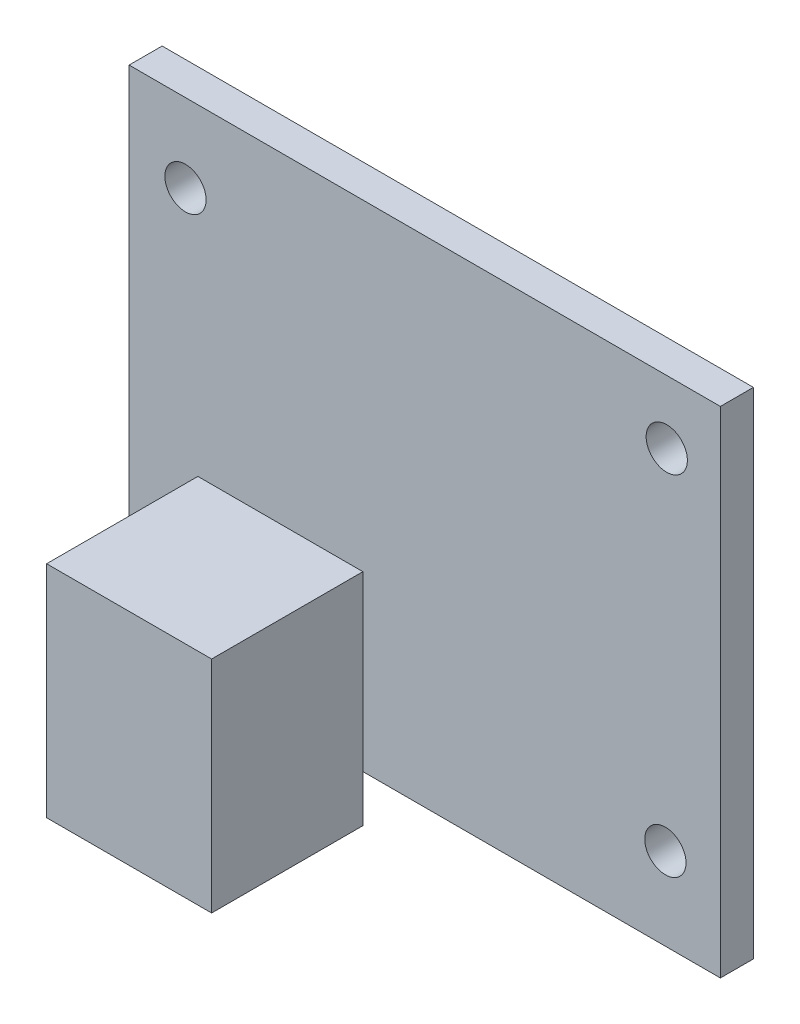
ISO-10303-21;
HEADER;
FILE_DESCRIPTION(('STEP AP214'),'2;1');
FILE_NAME('part.step','',(''),(''),'','','');
FILE_SCHEMA(('AUTOMOTIVE_DESIGN { 1 0 10303 214 1 1 1 1 }'));
ENDSEC;
DATA;
#1=APPLICATION_CONTEXT('core data for automotive mechanical design processes');
#2=APPLICATION_PROTOCOL_DEFINITION('international standard','automotive_design',2000,#1);
#3=PRODUCT_CONTEXT('',#1,'mechanical');
#4=PRODUCT('Part','Part','',(#3));
#5=PRODUCT_RELATED_PRODUCT_CATEGORY('part','',(#4));
#6=PRODUCT_DEFINITION_FORMATION('','',#4);
#7=PRODUCT_DEFINITION_CONTEXT('part definition',#1,'design');
#8=PRODUCT_DEFINITION('design','',#6,#7);
#9=PRODUCT_DEFINITION_SHAPE('','',#8);
#10=(LENGTH_UNIT() NAMED_UNIT(*) SI_UNIT(.MILLI.,.METRE.));
#11=(NAMED_UNIT(*) PLANE_ANGLE_UNIT() SI_UNIT($,.RADIAN.));
#12=(NAMED_UNIT(*) SI_UNIT($,.STERADIAN.) SOLID_ANGLE_UNIT());
#13=UNCERTAINTY_MEASURE_WITH_UNIT(LENGTH_MEASURE(1.E-05),#10,'distance_accuracy_value','');
#14=(GEOMETRIC_REPRESENTATION_CONTEXT(3) GLOBAL_UNCERTAINTY_ASSIGNED_CONTEXT((#13)) GLOBAL_UNIT_ASSIGNED_CONTEXT((#10,
#11,#12)) REPRESENTATION_CONTEXT('',''));
#15=CARTESIAN_POINT('',(0.,0.,0.));
#16=DIRECTION('',(0.,0.,1.));
#17=DIRECTION('',(1.,0.,0.));
#18=AXIS2_PLACEMENT_3D('',#15,#16,#17);
#19=CARTESIAN_POINT('',(0.,0.,2.4));
#20=DIRECTION('',(0.,0.,-1.));
#21=DIRECTION('',(-1.,0.,0.));
#22=AXIS2_PLACEMENT_3D('',#19,#20,#21);
#23=PLANE('',#22);
#24=CARTESIAN_POINT('',(39.1,31.4,2.4));
#25=DIRECTION('',(0.,0.,1.));
#26=DIRECTION('',(1.,0.,0.));
#27=AXIS2_PLACEMENT_3D('',#24,#25,#26);
#28=CIRCLE('',#27,1.5);
#29=CARTESIAN_POINT('',(40.6,31.4,2.4));
#30=VERTEX_POINT('',#29);
#31=EDGE_CURVE('E146',#30,#30,#28,.T.);
#32=ORIENTED_EDGE('',*,*,#31,.F.);
#33=EDGE_LOOP('',(#32));
#34=FACE_BOUND('',#33,.T.);
#35=CARTESIAN_POINT('',(4.09999999999999,30.3,2.4));
#36=DIRECTION('',(0.,0.,1.));
#37=DIRECTION('',(1.,0.,0.));
#38=AXIS2_PLACEMENT_3D('',#35,#36,#37);
#39=CIRCLE('',#38,1.5);
#40=CARTESIAN_POINT('',(5.59999999999999,30.3,2.4));
#41=VERTEX_POINT('',#40);
#42=EDGE_CURVE('E156',#41,#41,#39,.T.);
#43=ORIENTED_EDGE('',*,*,#42,.F.);
#44=EDGE_LOOP('',(#43));
#45=FACE_BOUND('',#44,.T.);
#46=CARTESIAN_POINT('',(39.,6.,2.4));
#47=DIRECTION('',(0.,0.,1.));
#48=DIRECTION('',(1.,0.,0.));
#49=AXIS2_PLACEMENT_3D('',#46,#47,#48);
#50=CIRCLE('',#49,1.5);
#51=CARTESIAN_POINT('',(40.5,6.,2.4));
#52=VERTEX_POINT('',#51);
#53=EDGE_CURVE('E164',#52,#52,#50,.T.);
#54=ORIENTED_EDGE('',*,*,#53,.F.);
#55=EDGE_LOOP('',(#54));
#56=FACE_BOUND('',#55,.T.);
#57=DIRECTION('',(0.,-1.,0.));
#58=VECTOR('',#57,1.);
#59=CARTESIAN_POINT('',(5.,12.5918610425844,2.4));
#60=LINE('',#59,#58);
#61=CARTESIAN_POINT('',(5.,12.5918610425844,2.4));
#62=VERTEX_POINT('',#61);
#63=CARTESIAN_POINT('',(5.,0.,2.4));
#64=VERTEX_POINT('',#63);
#65=EDGE_CURVE('E59',#62,#64,#60,.T.);
#66=ORIENTED_EDGE('',*,*,#65,.F.);
#67=DIRECTION('',(-1.,0.,0.));
#68=VECTOR('',#67,1.);
#69=CARTESIAN_POINT('',(5.,12.5918610425844,2.4));
#70=LINE('',#69,#68);
#71=CARTESIAN_POINT('',(17.,12.5918610425844,2.4));
#72=VERTEX_POINT('',#71);
#73=EDGE_CURVE('E134',#72,#62,#70,.T.);
#74=ORIENTED_EDGE('',*,*,#73,.F.);
#75=DIRECTION('',(0.,1.,0.));
#76=VECTOR('',#75,1.);
#77=CARTESIAN_POINT('',(17.,12.5918610425844,2.4));
#78=LINE('',#77,#76);
#79=CARTESIAN_POINT('',(17.,0.,2.4));
#80=VERTEX_POINT('',#79);
#81=EDGE_CURVE('E11',#80,#72,#78,.T.);
#82=ORIENTED_EDGE('',*,*,#81,.F.);
#83=DIRECTION('',(1.,0.,0.));
#84=VECTOR('',#83,1.);
#85=CARTESIAN_POINT('',(0.,0.,2.4));
#86=LINE('',#85,#84);
#87=CARTESIAN_POINT('',(43.,0.,2.4));
#88=VERTEX_POINT('',#87);
#89=EDGE_CURVE('E176',#80,#88,#86,.T.);
#90=ORIENTED_EDGE('',*,*,#89,.T.);
#91=DIRECTION('',(0.,1.,0.));
#92=VECTOR('',#91,1.);
#93=CARTESIAN_POINT('',(43.,0.,2.4));
#94=LINE('',#93,#92);
#95=CARTESIAN_POINT('',(43.,36.,2.4));
#96=VERTEX_POINT('',#95);
#97=EDGE_CURVE('E181',#88,#96,#94,.T.);
#98=ORIENTED_EDGE('',*,*,#97,.T.);
#99=DIRECTION('',(-1.,0.,0.));
#100=VECTOR('',#99,1.);
#101=CARTESIAN_POINT('',(0.,36.,2.4));
#102=LINE('',#101,#100);
#103=CARTESIAN_POINT('',(0.,36.,2.4));
#104=VERTEX_POINT('',#103);
#105=EDGE_CURVE('E185',#96,#104,#102,.T.);
#106=ORIENTED_EDGE('',*,*,#105,.T.);
#107=DIRECTION('',(0.,-1.,0.));
#108=VECTOR('',#107,1.);
#109=CARTESIAN_POINT('',(0.,0.,2.4));
#110=LINE('',#109,#108);
#111=CARTESIAN_POINT('',(0.,0.,2.4));
#112=VERTEX_POINT('',#111);
#113=EDGE_CURVE('E172',#104,#112,#110,.T.);
#114=ORIENTED_EDGE('',*,*,#113,.T.);
#115=EDGE_CURVE('E178',#112,#64,#86,.T.);
#116=ORIENTED_EDGE('',*,*,#115,.T.);
#117=EDGE_LOOP('',(#66,#74,#82,#90,#98,#106,#114,#116));
#118=FACE_BOUND('',#117,.T.);
#119=ADVANCED_FACE('F41',(#34,#45,#56,#118),#23,.F.);
#120=CARTESIAN_POINT('',(0.,0.,0.));
#121=DIRECTION('',(0.,0.,-1.));
#122=DIRECTION('',(-1.,0.,0.));
#123=AXIS2_PLACEMENT_3D('',#120,#121,#122);
#124=PLANE('',#123);
#125=CARTESIAN_POINT('',(4.09999999999999,30.3,0.));
#126=DIRECTION('',(0.,0.,1.));
#127=DIRECTION('',(1.,0.,0.));
#128=AXIS2_PLACEMENT_3D('',#125,#126,#127);
#129=CIRCLE('',#128,1.5);
#130=CARTESIAN_POINT('',(5.59999999999999,30.3,0.));
#131=VERTEX_POINT('',#130);
#132=EDGE_CURVE('E154',#131,#131,#129,.T.);
#133=ORIENTED_EDGE('',*,*,#132,.T.);
#134=EDGE_LOOP('',(#133));
#135=FACE_BOUND('',#134,.T.);
#136=DIRECTION('',(0.,-1.,0.));
#137=VECTOR('',#136,1.);
#138=CARTESIAN_POINT('',(0.,0.,0.));
#139=LINE('',#138,#137);
#140=CARTESIAN_POINT('',(0.,36.,0.));
#141=VERTEX_POINT('',#140);
#142=CARTESIAN_POINT('',(0.,0.,0.));
#143=VERTEX_POINT('',#142);
#144=EDGE_CURVE('E168',#141,#143,#139,.T.);
#145=ORIENTED_EDGE('',*,*,#144,.F.);
#146=DIRECTION('',(-1.,0.,0.));
#147=VECTOR('',#146,1.);
#148=CARTESIAN_POINT('',(0.,36.,0.));
#149=LINE('',#148,#147);
#150=CARTESIAN_POINT('',(43.,36.,0.));
#151=VERTEX_POINT('',#150);
#152=EDGE_CURVE('E177',#151,#141,#149,.T.);
#153=ORIENTED_EDGE('',*,*,#152,.F.);
#154=DIRECTION('',(0.,1.,0.));
#155=VECTOR('',#154,1.);
#156=CARTESIAN_POINT('',(43.,0.,0.));
#157=LINE('',#156,#155);
#158=CARTESIAN_POINT('',(43.,0.,0.));
#159=VERTEX_POINT('',#158);
#160=EDGE_CURVE('E195',#159,#151,#157,.T.);
#161=ORIENTED_EDGE('',*,*,#160,.F.);
#162=DIRECTION('',(1.,0.,0.));
#163=VECTOR('',#162,1.);
#164=CARTESIAN_POINT('',(0.,0.,0.));
#165=LINE('',#164,#163);
#166=EDGE_CURVE('E192',#143,#159,#165,.T.);
#167=ORIENTED_EDGE('',*,*,#166,.F.);
#168=EDGE_LOOP('',(#145,#153,#161,#167));
#169=FACE_BOUND('',#168,.T.);
#170=CARTESIAN_POINT('',(39.,6.,0.));
#171=DIRECTION('',(0.,0.,1.));
#172=DIRECTION('',(1.,0.,0.));
#173=AXIS2_PLACEMENT_3D('',#170,#171,#172);
#174=CIRCLE('',#173,1.5);
#175=CARTESIAN_POINT('',(40.5,6.,0.));
#176=VERTEX_POINT('',#175);
#177=EDGE_CURVE('E160',#176,#176,#174,.T.);
#178=ORIENTED_EDGE('',*,*,#177,.T.);
#179=EDGE_LOOP('',(#178));
#180=FACE_BOUND('',#179,.T.);
#181=CARTESIAN_POINT('',(39.1,31.4,0.));
#182=DIRECTION('',(0.,0.,1.));
#183=DIRECTION('',(1.,0.,0.));
#184=AXIS2_PLACEMENT_3D('',#181,#182,#183);
#185=CIRCLE('',#184,1.5);
#186=CARTESIAN_POINT('',(40.6,31.4,0.));
#187=VERTEX_POINT('',#186);
#188=EDGE_CURVE('E141',#187,#187,#185,.T.);
#189=ORIENTED_EDGE('',*,*,#188,.T.);
#190=EDGE_LOOP('',(#189));
#191=FACE_BOUND('',#190,.T.);
#192=ADVANCED_FACE('F224',(#135,#169,#180,#191),#124,.T.);
#193=CARTESIAN_POINT('',(0.,0.,2.4));
#194=DIRECTION('',(1.,0.,0.));
#195=DIRECTION('',(0.,0.,-1.));
#196=AXIS2_PLACEMENT_3D('',#193,#194,#195);
#197=PLANE('',#196);
#198=ORIENTED_EDGE('',*,*,#144,.T.);
#199=DIRECTION('',(0.,0.,-1.));
#200=VECTOR('',#199,1.);
#201=CARTESIAN_POINT('',(0.,0.,2.4));
#202=LINE('',#201,#200);
#203=EDGE_CURVE('E45',#112,#143,#202,.T.);
#204=ORIENTED_EDGE('',*,*,#203,.F.);
#205=ORIENTED_EDGE('',*,*,#113,.F.);
#206=DIRECTION('',(0.,0.,-1.));
#207=VECTOR('',#206,1.);
#208=CARTESIAN_POINT('',(0.,36.,2.4));
#209=LINE('',#208,#207);
#210=EDGE_CURVE('E188',#104,#141,#209,.T.);
#211=ORIENTED_EDGE('',*,*,#210,.T.);
#212=EDGE_LOOP('',(#198,#204,#205,#211));
#213=FACE_BOUND('',#212,.T.);
#214=ADVANCED_FACE('F43',(#213),#197,.F.);
#215=CARTESIAN_POINT('',(0.,0.,2.4));
#216=DIRECTION('',(0.,1.,0.));
#217=DIRECTION('',(0.,0.,1.));
#218=AXIS2_PLACEMENT_3D('',#215,#216,#217);
#219=PLANE('',#218);
#220=ORIENTED_EDGE('',*,*,#166,.T.);
#221=DIRECTION('',(0.,0.,-1.));
#222=VECTOR('',#221,1.);
#223=CARTESIAN_POINT('',(43.,0.,2.4));
#224=LINE('',#223,#222);
#225=EDGE_CURVE('E206',#88,#159,#224,.T.);
#226=ORIENTED_EDGE('',*,*,#225,.F.);
#227=ORIENTED_EDGE('',*,*,#89,.F.);
#228=EDGE_CURVE('E182',#64,#80,#86,.T.);
#229=ORIENTED_EDGE('',*,*,#228,.F.);
#230=ORIENTED_EDGE('',*,*,#115,.F.);
#231=ORIENTED_EDGE('',*,*,#203,.T.);
#232=EDGE_LOOP('',(#220,#226,#227,#229,#230,#231));
#233=FACE_BOUND('',#232,.T.);
#234=ADVANCED_FACE('F217',(#233),#219,.F.);
#235=CARTESIAN_POINT('',(43.,0.,2.4));
#236=DIRECTION('',(-1.,0.,0.));
#237=DIRECTION('',(0.,0.,1.));
#238=AXIS2_PLACEMENT_3D('',#235,#236,#237);
#239=PLANE('',#238);
#240=ORIENTED_EDGE('',*,*,#160,.T.);
#241=DIRECTION('',(0.,0.,-1.));
#242=VECTOR('',#241,1.);
#243=CARTESIAN_POINT('',(43.,36.,2.4));
#244=LINE('',#243,#242);
#245=EDGE_CURVE('E203',#96,#151,#244,.T.);
#246=ORIENTED_EDGE('',*,*,#245,.F.);
#247=ORIENTED_EDGE('',*,*,#97,.F.);
#248=ORIENTED_EDGE('',*,*,#225,.T.);
#249=EDGE_LOOP('',(#240,#246,#247,#248));
#250=FACE_BOUND('',#249,.T.);
#251=ADVANCED_FACE('F227',(#250),#239,.F.);
#252=CARTESIAN_POINT('',(0.,36.,2.4));
#253=DIRECTION('',(0.,-1.,0.));
#254=DIRECTION('',(0.,0.,-1.));
#255=AXIS2_PLACEMENT_3D('',#252,#253,#254);
#256=PLANE('',#255);
#257=ORIENTED_EDGE('',*,*,#152,.T.);
#258=ORIENTED_EDGE('',*,*,#210,.F.);
#259=ORIENTED_EDGE('',*,*,#105,.F.);
#260=ORIENTED_EDGE('',*,*,#245,.T.);
#261=EDGE_LOOP('',(#257,#258,#259,#260));
#262=FACE_BOUND('',#261,.T.);
#263=ADVANCED_FACE('F230',(#262),#256,.F.);
#264=CARTESIAN_POINT('',(39.,6.,2.4));
#265=DIRECTION('',(0.,0.,-1.));
#266=DIRECTION('',(-1.,0.,0.));
#267=AXIS2_PLACEMENT_3D('',#264,#265,#266);
#268=CYLINDRICAL_SURFACE('',#267,1.5);
#269=ORIENTED_EDGE('',*,*,#53,.T.);
#270=EDGE_LOOP('',(#269));
#271=FACE_BOUND('',#270,.T.);
#272=ORIENTED_EDGE('',*,*,#177,.F.);
#273=EDGE_LOOP('',(#272));
#274=FACE_BOUND('',#273,.T.);
#275=ADVANCED_FACE('F281',(#271,#274),#268,.F.);
#276=CARTESIAN_POINT('',(4.09999999999999,30.3,2.4));
#277=DIRECTION('',(0.,0.,-1.));
#278=DIRECTION('',(-1.,0.,0.));
#279=AXIS2_PLACEMENT_3D('',#276,#277,#278);
#280=CYLINDRICAL_SURFACE('',#279,1.5);
#281=ORIENTED_EDGE('',*,*,#42,.T.);
#282=EDGE_LOOP('',(#281));
#283=FACE_BOUND('',#282,.T.);
#284=ORIENTED_EDGE('',*,*,#132,.F.);
#285=EDGE_LOOP('',(#284));
#286=FACE_BOUND('',#285,.T.);
#287=ADVANCED_FACE('F339',(#283,#286),#280,.F.);
#288=CARTESIAN_POINT('',(39.1,31.4,2.4));
#289=DIRECTION('',(0.,0.,-1.));
#290=DIRECTION('',(-1.,0.,0.));
#291=AXIS2_PLACEMENT_3D('',#288,#289,#290);
#292=CYLINDRICAL_SURFACE('',#291,1.5);
#293=ORIENTED_EDGE('',*,*,#31,.T.);
#294=EDGE_LOOP('',(#293));
#295=FACE_BOUND('',#294,.T.);
#296=ORIENTED_EDGE('',*,*,#188,.F.);
#297=EDGE_LOOP('',(#296));
#298=FACE_BOUND('',#297,.T.);
#299=ADVANCED_FACE('F347',(#295,#298),#292,.F.);
#300=CARTESIAN_POINT('',(0.,0.,2.4));
#301=DIRECTION('',(0.,0.,1.));
#302=DIRECTION('',(1.,0.,0.));
#303=AXIS2_PLACEMENT_3D('',#300,#301,#302);
#304=PLANE('',#303);
#305=CARTESIAN_POINT('',(5.,-3.40813895741562,2.4));
#306=VERTEX_POINT('',#305);
#307=EDGE_CURVE('E138',#64,#306,#60,.T.);
#308=ORIENTED_EDGE('',*,*,#307,.F.);
#309=ORIENTED_EDGE('',*,*,#228,.T.);
#310=CARTESIAN_POINT('',(17.,-3.40813895741562,2.4));
#311=VERTEX_POINT('',#310);
#312=EDGE_CURVE('E52',#311,#80,#78,.T.);
#313=ORIENTED_EDGE('',*,*,#312,.F.);
#314=DIRECTION('',(1.,0.,0.));
#315=VECTOR('',#314,1.);
#316=CARTESIAN_POINT('',(5.,-3.40813895741562,2.4));
#317=LINE('',#316,#315);
#318=EDGE_CURVE('E243',#306,#311,#317,.T.);
#319=ORIENTED_EDGE('',*,*,#318,.F.);
#320=EDGE_LOOP('',(#308,#309,#313,#319));
#321=FACE_BOUND('',#320,.T.);
#322=ADVANCED_FACE('F237',(#321),#304,.F.);
#323=CARTESIAN_POINT('',(5.,12.5918610425844,13.4));
#324=DIRECTION('',(1.,0.,0.));
#325=DIRECTION('',(0.,1.,0.));
#326=AXIS2_PLACEMENT_3D('',#323,#324,#325);
#327=PLANE('',#326);
#328=ORIENTED_EDGE('',*,*,#65,.T.);
#329=ORIENTED_EDGE('',*,*,#307,.T.);
#330=DIRECTION('',(0.,0.,-1.));
#331=VECTOR('',#330,1.);
#332=CARTESIAN_POINT('',(5.,-3.40813895741562,13.4));
#333=LINE('',#332,#331);
#334=CARTESIAN_POINT('',(5.,-3.40813895741562,13.4));
#335=VERTEX_POINT('',#334);
#336=EDGE_CURVE('E117',#335,#306,#333,.T.);
#337=ORIENTED_EDGE('',*,*,#336,.F.);
#338=DIRECTION('',(0.,-1.,0.));
#339=VECTOR('',#338,1.);
#340=CARTESIAN_POINT('',(5.,12.5918610425844,13.4));
#341=LINE('',#340,#339);
#342=CARTESIAN_POINT('',(5.,12.5918610425844,13.4));
#343=VERTEX_POINT('',#342);
#344=EDGE_CURVE('E124',#343,#335,#341,.T.);
#345=ORIENTED_EDGE('',*,*,#344,.F.);
#346=DIRECTION('',(0.,0.,-1.));
#347=VECTOR('',#346,1.);
#348=CARTESIAN_POINT('',(5.,12.5918610425844,13.4));
#349=LINE('',#348,#347);
#350=EDGE_CURVE('E250',#343,#62,#349,.T.);
#351=ORIENTED_EDGE('',*,*,#350,.T.);
#352=EDGE_LOOP('',(#328,#329,#337,#345,#351));
#353=FACE_BOUND('',#352,.T.);
#354=ADVANCED_FACE('F136',(#353),#327,.F.);
#355=CARTESIAN_POINT('',(5.,-3.40813895741562,13.4));
#356=DIRECTION('',(0.,1.,0.));
#357=DIRECTION('',(0.,0.,1.));
#358=AXIS2_PLACEMENT_3D('',#355,#356,#357);
#359=PLANE('',#358);
#360=ORIENTED_EDGE('',*,*,#318,.T.);
#361=DIRECTION('',(0.,0.,-1.));
#362=VECTOR('',#361,1.);
#363=CARTESIAN_POINT('',(17.,-3.40813895741562,13.4));
#364=LINE('',#363,#362);
#365=CARTESIAN_POINT('',(17.,-3.40813895741562,13.4));
#366=VERTEX_POINT('',#365);
#367=EDGE_CURVE('E119',#366,#311,#364,.T.);
#368=ORIENTED_EDGE('',*,*,#367,.F.);
#369=DIRECTION('',(1.,0.,0.));
#370=VECTOR('',#369,1.);
#371=CARTESIAN_POINT('',(5.,-3.40813895741562,13.4));
#372=LINE('',#371,#370);
#373=EDGE_CURVE('E113',#335,#366,#372,.T.);
#374=ORIENTED_EDGE('',*,*,#373,.F.);
#375=ORIENTED_EDGE('',*,*,#336,.T.);
#376=EDGE_LOOP('',(#360,#368,#374,#375));
#377=FACE_BOUND('',#376,.T.);
#378=ADVANCED_FACE('F115',(#377),#359,.F.);
#379=CARTESIAN_POINT('',(17.,12.5918610425844,13.4));
#380=DIRECTION('',(-1.,0.,0.));
#381=DIRECTION('',(0.,0.,1.));
#382=AXIS2_PLACEMENT_3D('',#379,#380,#381);
#383=PLANE('',#382);
#384=ORIENTED_EDGE('',*,*,#312,.T.);
#385=ORIENTED_EDGE('',*,*,#81,.T.);
#386=DIRECTION('',(0.,0.,-1.));
#387=VECTOR('',#386,1.);
#388=CARTESIAN_POINT('',(17.,12.5918610425844,13.4));
#389=LINE('',#388,#387);
#390=CARTESIAN_POINT('',(17.,12.5918610425844,13.4));
#391=VERTEX_POINT('',#390);
#392=EDGE_CURVE('E148',#391,#72,#389,.T.);
#393=ORIENTED_EDGE('',*,*,#392,.F.);
#394=DIRECTION('',(0.,1.,0.));
#395=VECTOR('',#394,1.);
#396=CARTESIAN_POINT('',(17.,12.5918610425844,13.4));
#397=LINE('',#396,#395);
#398=EDGE_CURVE('E123',#366,#391,#397,.T.);
#399=ORIENTED_EDGE('',*,*,#398,.F.);
#400=ORIENTED_EDGE('',*,*,#367,.T.);
#401=EDGE_LOOP('',(#384,#385,#393,#399,#400));
#402=FACE_BOUND('',#401,.T.);
#403=ADVANCED_FACE('F239',(#402),#383,.F.);
#404=CARTESIAN_POINT('',(5.,12.5918610425844,13.4));
#405=DIRECTION('',(0.,-1.,0.));
#406=DIRECTION('',(1.,0.,0.));
#407=AXIS2_PLACEMENT_3D('',#404,#405,#406);
#408=PLANE('',#407);
#409=ORIENTED_EDGE('',*,*,#73,.T.);
#410=ORIENTED_EDGE('',*,*,#350,.F.);
#411=DIRECTION('',(-1.,0.,0.));
#412=VECTOR('',#411,1.);
#413=CARTESIAN_POINT('',(5.,12.5918610425844,13.4));
#414=LINE('',#413,#412);
#415=EDGE_CURVE('E129',#391,#343,#414,.T.);
#416=ORIENTED_EDGE('',*,*,#415,.F.);
#417=ORIENTED_EDGE('',*,*,#392,.T.);
#418=EDGE_LOOP('',(#409,#410,#416,#417));
#419=FACE_BOUND('',#418,.T.);
#420=ADVANCED_FACE('F254',(#419),#408,.F.);
#421=CARTESIAN_POINT('',(0.,0.,13.4));
#422=DIRECTION('',(0.,0.,1.));
#423=DIRECTION('',(1.,0.,0.));
#424=AXIS2_PLACEMENT_3D('',#421,#422,#423);
#425=PLANE('',#424);
#426=ORIENTED_EDGE('',*,*,#344,.T.);
#427=ORIENTED_EDGE('',*,*,#373,.T.);
#428=ORIENTED_EDGE('',*,*,#398,.T.);
#429=ORIENTED_EDGE('',*,*,#415,.T.);
#430=EDGE_LOOP('',(#426,#427,#428,#429));
#431=FACE_BOUND('',#430,.T.);
#432=ADVANCED_FACE('F127',(#431),#425,.T.);
#433=CLOSED_SHELL('',(#119,#192,#214,#234,#251,#263,#275,#287,#299,#322,#354,#378,#403,#420,#432));
#434=MANIFOLD_SOLID_BREP('B2',#433);
#435=ADVANCED_BREP_SHAPE_REPRESENTATION('',(#18,#434),#14);
#436=SHAPE_DEFINITION_REPRESENTATION(#9,#435);
ENDSEC;
END-ISO-10303-21;
